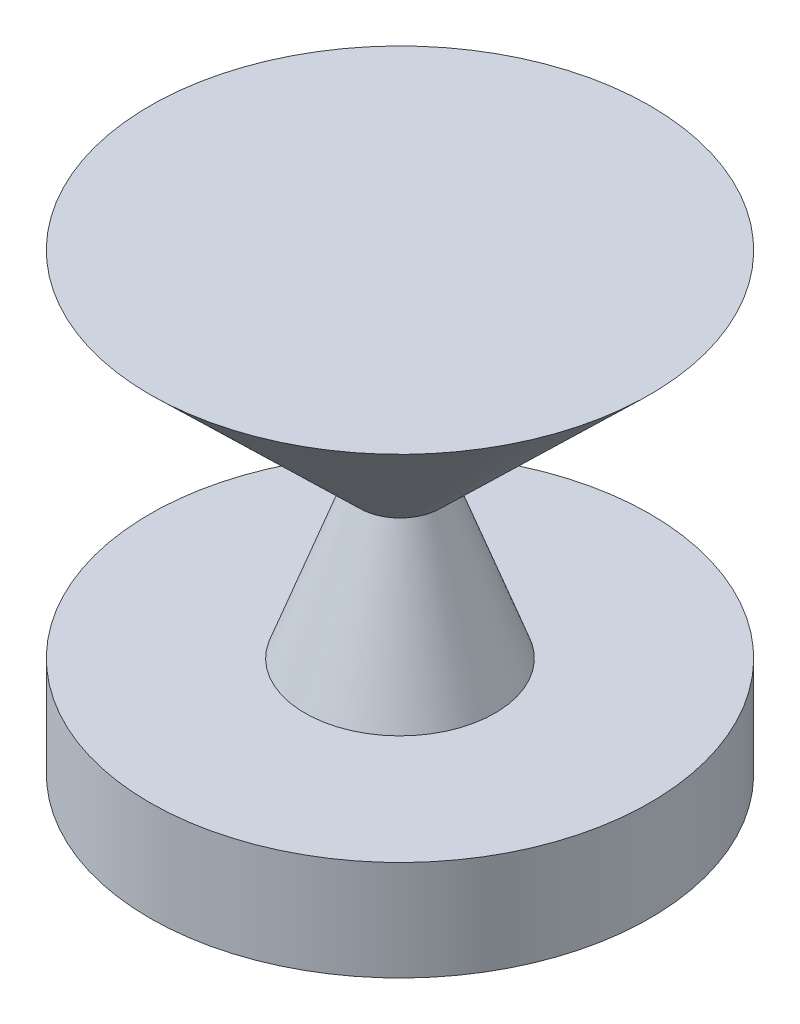
ISO-10303-21;
HEADER;
FILE_DESCRIPTION(('STEP AP214'),'2;1');
FILE_NAME('part.step','',(''),(''),'','','');
FILE_SCHEMA(('AUTOMOTIVE_DESIGN { 1 0 10303 214 1 1 1 1 }'));
ENDSEC;
DATA;
#1=APPLICATION_CONTEXT('core data for automotive mechanical design processes');
#2=APPLICATION_PROTOCOL_DEFINITION('international standard','automotive_design',2000,#1);
#3=PRODUCT_CONTEXT('',#1,'mechanical');
#4=PRODUCT('Part','Part','',(#3));
#5=PRODUCT_RELATED_PRODUCT_CATEGORY('part','',(#4));
#6=PRODUCT_DEFINITION_FORMATION('','',#4);
#7=PRODUCT_DEFINITION_CONTEXT('part definition',#1,'design');
#8=PRODUCT_DEFINITION('design','',#6,#7);
#9=PRODUCT_DEFINITION_SHAPE('','',#8);
#10=(LENGTH_UNIT() NAMED_UNIT(*) SI_UNIT(.MILLI.,.METRE.));
#11=(NAMED_UNIT(*) PLANE_ANGLE_UNIT() SI_UNIT($,.RADIAN.));
#12=(NAMED_UNIT(*) SI_UNIT($,.STERADIAN.) SOLID_ANGLE_UNIT());
#13=UNCERTAINTY_MEASURE_WITH_UNIT(LENGTH_MEASURE(1.E-05),#10,'distance_accuracy_value','');
#14=(GEOMETRIC_REPRESENTATION_CONTEXT(3) GLOBAL_UNCERTAINTY_ASSIGNED_CONTEXT((#13)) GLOBAL_UNIT_ASSIGNED_CONTEXT((#10,
#11,#12)) REPRESENTATION_CONTEXT('',''));
#15=CARTESIAN_POINT('',(0.,0.,0.));
#16=DIRECTION('',(0.,0.,1.));
#17=DIRECTION('',(1.,0.,0.));
#18=AXIS2_PLACEMENT_3D('',#15,#16,#17);
#19=CARTESIAN_POINT('',(0.,0.,0.));
#20=DIRECTION('',(0.,1.,0.));
#21=DIRECTION('',(0.,0.,1.));
#22=AXIS2_PLACEMENT_3D('',#19,#20,#21);
#23=PLANE('',#22);
#24=CARTESIAN_POINT('',(0.,0.,0.));
#25=DIRECTION('',(0.,-1.,0.));
#26=DIRECTION('',(0.,0.,-1.));
#27=AXIS2_PLACEMENT_3D('',#24,#25,#26);
#28=CIRCLE('',#27,5.);
#29=CARTESIAN_POINT('',(0.,0.,-5.));
#30=VERTEX_POINT('',#29);
#31=EDGE_CURVE('E10',#30,#30,#28,.T.);
#32=ORIENTED_EDGE('',*,*,#31,.T.);
#33=EDGE_LOOP('',(#32));
#34=FACE_BOUND('',#33,.T.);
#35=ADVANCED_FACE('F37',(#34),#23,.F.);
#36=CARTESIAN_POINT('',(0.,0.,0.));
#37=DIRECTION('',(0.,-1.,0.));
#38=DIRECTION('',(0.,0.,-1.));
#39=AXIS2_PLACEMENT_3D('',#36,#37,#38);
#40=CYLINDRICAL_SURFACE('',#39,5.);
#41=ORIENTED_EDGE('',*,*,#31,.F.);
#42=EDGE_LOOP('',(#41));
#43=FACE_BOUND('',#42,.T.);
#44=CARTESIAN_POINT('',(0.,2.,0.));
#45=DIRECTION('',(0.,-1.,0.));
#46=DIRECTION('',(0.,0.,-1.));
#47=AXIS2_PLACEMENT_3D('',#44,#45,#46);
#48=CIRCLE('',#47,5.);
#49=CARTESIAN_POINT('',(0.,2.,-5.));
#50=VERTEX_POINT('',#49);
#51=EDGE_CURVE('E43',#50,#50,#48,.T.);
#52=ORIENTED_EDGE('',*,*,#51,.T.);
#53=EDGE_LOOP('',(#52));
#54=FACE_BOUND('',#53,.T.);
#55=ADVANCED_FACE('F72',(#43,#54),#40,.T.);
#56=CARTESIAN_POINT('',(-5.,2.,0.));
#57=DIRECTION('',(0.,-1.,0.));
#58=DIRECTION('',(0.,0.,-1.));
#59=AXIS2_PLACEMENT_3D('',#56,#57,#58);
#60=PLANE('',#59);
#61=ORIENTED_EDGE('',*,*,#51,.F.);
#62=EDGE_LOOP('',(#61));
#63=FACE_BOUND('',#62,.T.);
#64=CARTESIAN_POINT('',(0.,2.,0.));
#65=DIRECTION('',(0.,-1.,0.));
#66=DIRECTION('',(0.,0.,-1.));
#67=AXIS2_PLACEMENT_3D('',#64,#65,#66);
#68=CIRCLE('',#67,1.9);
#69=CARTESIAN_POINT('',(0.,2.,-1.9));
#70=VERTEX_POINT('',#69);
#71=EDGE_CURVE('E47',#70,#70,#68,.T.);
#72=ORIENTED_EDGE('',*,*,#71,.T.);
#73=EDGE_LOOP('',(#72));
#74=FACE_BOUND('',#73,.T.);
#75=ADVANCED_FACE('F76',(#63,#74),#60,.F.);
#76=CARTESIAN_POINT('',(0.,5.,0.));
#77=DIRECTION('',(0.,-1.,0.));
#78=DIRECTION('',(0.,0.,-1.));
#79=AXIS2_PLACEMENT_3D('',#76,#77,#78);
#80=CONICAL_SURFACE('',#79,0.808089297201406,0.349065850398862);
#81=ORIENTED_EDGE('',*,*,#71,.F.);
#82=EDGE_LOOP('',(#81));
#83=FACE_BOUND('',#82,.T.);
#84=CARTESIAN_POINT('',(0.,5.,0.));
#85=DIRECTION('',(0.,-1.,0.));
#86=DIRECTION('',(0.,0.,-1.));
#87=AXIS2_PLACEMENT_3D('',#84,#85,#86);
#88=CIRCLE('',#87,0.808089297201406);
#89=CARTESIAN_POINT('',(0.,5.,0.808089297201406));
#90=VERTEX_POINT('',#89);
#91=EDGE_CURVE('E51',#90,#90,#88,.T.);
#92=ORIENTED_EDGE('',*,*,#91,.T.);
#93=EDGE_LOOP('',(#92));
#94=FACE_BOUND('',#93,.T.);
#95=ADVANCED_FACE('F68',(#83,#94),#80,.T.);
#96=CARTESIAN_POINT('',(0.,9.06691535656878,0.));
#97=DIRECTION('',(0.,1.,0.));
#98=DIRECTION('',(0.,0.,1.));
#99=AXIS2_PLACEMENT_3D('',#96,#97,#98);
#100=CONICAL_SURFACE('',#99,5.,0.800531767470485);
#101=CARTESIAN_POINT('',(0.,9.06691535656878,0.));
#102=DIRECTION('',(0.,-1.,0.));
#103=DIRECTION('',(0.,0.,-1.));
#104=AXIS2_PLACEMENT_3D('',#101,#102,#103);
#105=CIRCLE('',#104,5.);
#106=CARTESIAN_POINT('',(0.,9.06691535656879,5.));
#107=VERTEX_POINT('',#106);
#108=EDGE_CURVE('E56',#107,#107,#105,.T.);
#109=CARTESIAN_POINT('',(0.,5.,0.808089297201406));
#110=CARTESIAN_POINT('',(0.,5.04236370163092,0.851755033688891));
#111=CARTESIAN_POINT('',(0.,5.08472740326185,0.895420770176376));
#112=CARTESIAN_POINT('',(0.,5.1694548065237,0.982752243151347));
#113=CARTESIAN_POINT('',(0.,5.21181850815462,1.02641797963883));
#114=CARTESIAN_POINT('',(0.,5.29654591141647,1.1137494526138));
#115=CARTESIAN_POINT('',(0.,5.3389096130474,1.15741518910129));
#116=CARTESIAN_POINT('',(0.,5.42363701630925,1.24474666207626));
#117=CARTESIAN_POINT('',(0.,5.46600071794017,1.28841239856374));
#118=CARTESIAN_POINT('',(0.,5.55072812120202,1.37574387153871));
#119=CARTESIAN_POINT('',(0.,5.59309182283295,1.4194096080262));
#120=CARTESIAN_POINT('',(0.,5.6778192260948,1.50674108100117));
#121=CARTESIAN_POINT('',(0.,5.72018292772572,1.55040681748866));
#122=CARTESIAN_POINT('',(0.,5.80491033098757,1.63773829046363));
#123=CARTESIAN_POINT('',(0.,5.8472740326185,1.68140402695111));
#124=CARTESIAN_POINT('',(0.,5.93200143588035,1.76873549992608));
#125=CARTESIAN_POINT('',(0.,5.97436513751127,1.81240123641357));
#126=CARTESIAN_POINT('',(0.,6.05909254077312,1.89973270938854));
#127=CARTESIAN_POINT('',(0.,6.10145624240405,1.94339844587603));
#128=CARTESIAN_POINT('',(0.,6.18618364566589,2.030729918851));
#129=CARTESIAN_POINT('',(0.,6.22854734729682,2.07439565533848));
#130=CARTESIAN_POINT('',(0.,6.31327475055867,2.16172712831345));
#131=CARTESIAN_POINT('',(0.,6.35563845218959,2.20539286480094));
#132=CARTESIAN_POINT('',(0.,6.44036585545144,2.29272433777591));
#133=CARTESIAN_POINT('',(0.,6.48272955708237,2.33639007426339));
#134=CARTESIAN_POINT('',(0.,6.56745696034422,2.42372154723836));
#135=CARTESIAN_POINT('',(0.,6.60982066197514,2.46738728372585));
#136=CARTESIAN_POINT('',(0.,6.69454806523699,2.55471875670082));
#137=CARTESIAN_POINT('',(0.,6.73691176686792,2.59838449318831));
#138=CARTESIAN_POINT('',(0.,6.82163917012977,2.68571596616328));
#139=CARTESIAN_POINT('',(0.,6.86400287176069,2.72938170265076));
#140=CARTESIAN_POINT('',(0.,6.94873027502254,2.81671317562573));
#141=CARTESIAN_POINT('',(0.,6.99109397665347,2.86037891211322));
#142=CARTESIAN_POINT('',(0.,7.07582137991532,2.94771038508819));
#143=CARTESIAN_POINT('',(0.,7.11818508154624,2.99137612157567));
#144=CARTESIAN_POINT('',(0.,7.20291248480809,3.07870759455064));
#145=CARTESIAN_POINT('',(0.,7.24527618643902,3.12237333103813));
#146=CARTESIAN_POINT('',(0.,7.33000358970087,3.2097048040131));
#147=CARTESIAN_POINT('',(0.,7.37236729133179,3.25337054050059));
#148=CARTESIAN_POINT('',(0.,7.45709469459364,3.34070201347556));
#149=CARTESIAN_POINT('',(0.,7.49945839622456,3.38436774996304));
#150=CARTESIAN_POINT('',(0.,7.58418579948641,3.47169922293801));
#151=CARTESIAN_POINT('',(0.,7.62654950111734,3.5153649594255));
#152=CARTESIAN_POINT('',(0.,7.71127690437919,3.60269643240047));
#153=CARTESIAN_POINT('',(0.,7.75364060601011,3.64636216888795));
#154=CARTESIAN_POINT('',(0.,7.83836800927196,3.73369364186292));
#155=CARTESIAN_POINT('',(0.,7.88073171090289,3.77735937835041));
#156=CARTESIAN_POINT('',(0.,7.96545911416474,3.86469085132538));
#157=CARTESIAN_POINT('',(0.,8.00782281579566,3.90835658781287));
#158=CARTESIAN_POINT('',(0.,8.09255021905751,3.99568806078784));
#159=CARTESIAN_POINT('',(0.,8.13491392068844,4.03935379727532));
#160=CARTESIAN_POINT('',(0.,8.21964132395029,4.12668527025029));
#161=CARTESIAN_POINT('',(0.,8.26200502558121,4.17035100673778));
#162=CARTESIAN_POINT('',(0.,8.34673242884306,4.25768247971275));
#163=CARTESIAN_POINT('',(0.,8.38909613047399,4.30134821620023));
#164=CARTESIAN_POINT('',(0.,8.47382353373584,4.38867968917521));
#165=CARTESIAN_POINT('',(0.,8.51618723536676,4.43234542566269));
#166=CARTESIAN_POINT('',(0.,8.60091463862861,4.51967689863766));
#167=CARTESIAN_POINT('',(0.,8.64327834025953,4.56334263512515));
#168=CARTESIAN_POINT('',(0.,8.72800574352139,4.65067410810012));
#169=CARTESIAN_POINT('',(0.,8.77036944515231,4.6943398445876));
#170=CARTESIAN_POINT('',(0.,8.85509684841416,4.78167131756257));
#171=CARTESIAN_POINT('',(0.,8.89746055004508,4.82533705405006));
#172=CARTESIAN_POINT('',(0.,8.98218795330693,4.91266852702503));
#173=CARTESIAN_POINT('',(0.,9.02455165493786,4.95633426351251));
#174=CARTESIAN_POINT('',(0.,9.06691535656878,5.));
#175=B_SPLINE_CURVE_WITH_KNOTS('',3,(#109,#110,#111,#112,#113,#114,#115,#116,#117,#118,#119,
#120,#121,#122,#123,#124,#125,#126,#127,#128,#129,#130,#131,#132,#133,#134,#135,#136,#137,#138,
#139,#140,#141,#142,#143,#144,#145,#146,#147,#148,#149,#150,#151,#152,#153,#154,#155,#156,#157,
#158,#159,#160,#161,#162,#163,#164,#165,#166,#167,#168,#169,#170,#171,#172,#173,#174),
.UNSPECIFIED.,.F.,.F.,(4,2,2,2,2,2,2,2,2,2,2,2,2,2,2,2,2,2,2,2,2,2,2,2,2,2,2,2,2,2,2,2,4),(0.,
0.182516897381631,0.365033794763262,0.547550692144892,0.730067589526524,0.912584486908155,
1.09510138428979,1.27761828167142,1.46013517905305,1.64265207643468,1.82516897381631,
2.00768587119794,2.19020276857957,2.3727196659612,2.55523656334283,2.73775346072446,
2.92027035810609,3.10278725548773,3.28530415286936,3.46782105025099,3.65033794763262,
3.83285484501425,4.01537174239588,4.19788863977751,4.38040553715914,4.56292243454077,
4.7454393319224,4.92795622930403,5.11047312668567,5.2929900240673,5.47550692144893,
5.65802381883056,5.84054071621219),.UNSPECIFIED.);
#176=EDGE_CURVE('BSEAM60',#90,#107,#175,.T.);
#177=ORIENTED_EDGE('',*,*,#91,.F.);
#178=ORIENTED_EDGE('',*,*,#108,.T.);
#179=ORIENTED_EDGE('',*,*,#176,.T.);
#180=ORIENTED_EDGE('',*,*,#176,.F.);
#181=EDGE_LOOP('',(#177,#179,#178,#180));
#182=FACE_BOUND('',#181,.T.);
#183=ADVANCED_FACE('F60',(#182),#100,.T.);
#184=CARTESIAN_POINT('',(-5.,9.06691535656878,0.));
#185=DIRECTION('',(0.,-1.,0.));
#186=DIRECTION('',(0.,0.,-1.));
#187=AXIS2_PLACEMENT_3D('',#184,#185,#186);
#188=PLANE('',#187);
#189=ORIENTED_EDGE('',*,*,#108,.F.);
#190=EDGE_LOOP('',(#189));
#191=FACE_BOUND('',#190,.T.);
#192=ADVANCED_FACE('F62',(#191),#188,.F.);
#193=CLOSED_SHELL('',(#35,#55,#75,#95,#183,#192));
#194=MANIFOLD_SOLID_BREP('B2',#193);
#195=ADVANCED_BREP_SHAPE_REPRESENTATION('',(#18,#194),#14);
#196=SHAPE_DEFINITION_REPRESENTATION(#9,#195);
ENDSEC;
END-ISO-10303-21;
